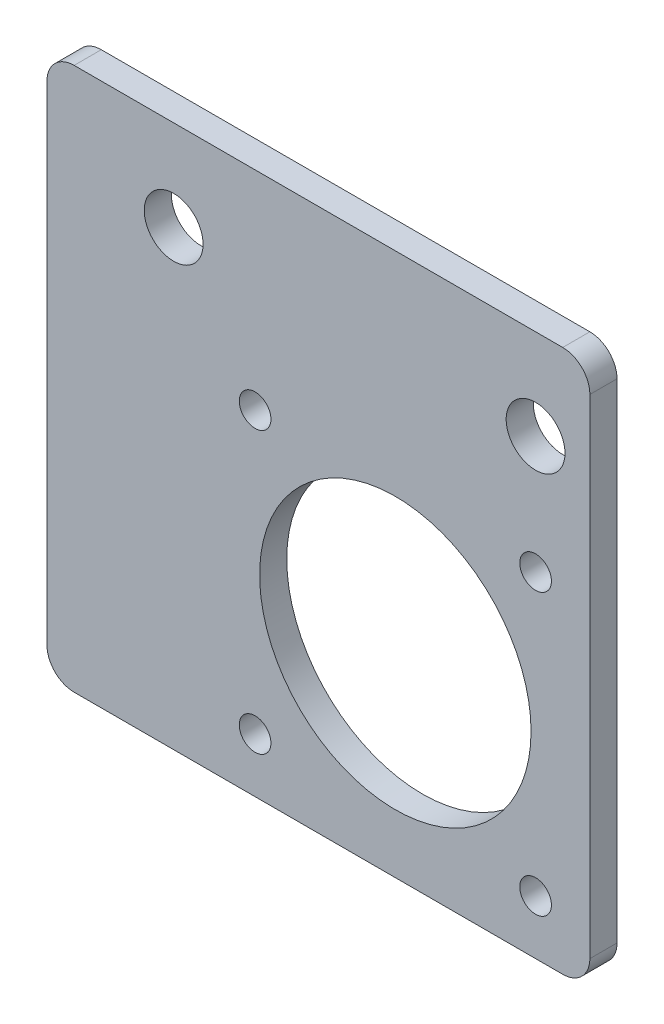
ISO-10303-21;
HEADER;
FILE_DESCRIPTION(('STEP AP214'),'2;1');
FILE_NAME('part.step','',(''),(''),'','','');
FILE_SCHEMA(('AUTOMOTIVE_DESIGN { 1 0 10303 214 1 1 1 1 }'));
ENDSEC;
DATA;
#1=APPLICATION_CONTEXT('core data for automotive mechanical design processes');
#2=APPLICATION_PROTOCOL_DEFINITION('international standard','automotive_design',2000,#1);
#3=PRODUCT_CONTEXT('',#1,'mechanical');
#4=PRODUCT('Part','Part','',(#3));
#5=PRODUCT_RELATED_PRODUCT_CATEGORY('part','',(#4));
#6=PRODUCT_DEFINITION_FORMATION('','',#4);
#7=PRODUCT_DEFINITION_CONTEXT('part definition',#1,'design');
#8=PRODUCT_DEFINITION('design','',#6,#7);
#9=PRODUCT_DEFINITION_SHAPE('','',#8);
#10=(LENGTH_UNIT() NAMED_UNIT(*) SI_UNIT(.MILLI.,.METRE.));
#11=(NAMED_UNIT(*) PLANE_ANGLE_UNIT() SI_UNIT($,.RADIAN.));
#12=(NAMED_UNIT(*) SI_UNIT($,.STERADIAN.) SOLID_ANGLE_UNIT());
#13=UNCERTAINTY_MEASURE_WITH_UNIT(LENGTH_MEASURE(1.E-05),#10,'distance_accuracy_value','');
#14=(GEOMETRIC_REPRESENTATION_CONTEXT(3) GLOBAL_UNCERTAINTY_ASSIGNED_CONTEXT((#13)) GLOBAL_UNIT_ASSIGNED_CONTEXT((#10,
#11,#12)) REPRESENTATION_CONTEXT('',''));
#15=CARTESIAN_POINT('',(0.,0.,0.));
#16=DIRECTION('',(0.,0.,1.));
#17=DIRECTION('',(1.,0.,0.));
#18=AXIS2_PLACEMENT_3D('',#15,#16,#17);
#19=CARTESIAN_POINT('',(-30.,30.,3.));
#20=DIRECTION('',(1.,0.,0.));
#21=DIRECTION('',(0.,1.,0.));
#22=AXIS2_PLACEMENT_3D('',#19,#20,#21);
#23=PLANE('',#22);
#24=DIRECTION('',(0.,-1.,0.));
#25=VECTOR('',#24,1.);
#26=CARTESIAN_POINT('',(-30.,30.,3.));
#27=LINE('',#26,#25);
#28=CARTESIAN_POINT('',(-30.,27.,3.));
#29=VERTEX_POINT('',#28);
#30=CARTESIAN_POINT('',(-30.,-27.,3.));
#31=VERTEX_POINT('',#30);
#32=EDGE_CURVE('E122',#29,#31,#27,.T.);
#33=ORIENTED_EDGE('',*,*,#32,.F.);
#34=DIRECTION('',(0.,0.,-1.));
#35=VECTOR('',#34,1.);
#36=CARTESIAN_POINT('',(-30.,27.,3.));
#37=LINE('',#36,#35);
#38=CARTESIAN_POINT('',(-30.,27.,0.));
#39=VERTEX_POINT('',#38);
#40=EDGE_CURVE('E107',#29,#39,#37,.T.);
#41=ORIENTED_EDGE('',*,*,#40,.T.);
#42=DIRECTION('',(0.,-1.,0.));
#43=VECTOR('',#42,1.);
#44=CARTESIAN_POINT('',(-30.,30.,0.));
#45=LINE('',#44,#43);
#46=CARTESIAN_POINT('',(-30.,-27.,0.));
#47=VERTEX_POINT('',#46);
#48=EDGE_CURVE('E119',#39,#47,#45,.T.);
#49=ORIENTED_EDGE('',*,*,#48,.T.);
#50=DIRECTION('',(0.,0.,-1.));
#51=VECTOR('',#50,1.);
#52=CARTESIAN_POINT('',(-30.,-27.,3.));
#53=LINE('',#52,#51);
#54=EDGE_CURVE('E124',#47,#31,#53,.F.);
#55=ORIENTED_EDGE('',*,*,#54,.T.);
#56=EDGE_LOOP('',(#33,#41,#49,#55));
#57=FACE_BOUND('',#56,.T.);
#58=ADVANCED_FACE('F35',(#57),#23,.F.);
#59=CARTESIAN_POINT('',(30.,-30.,3.));
#60=DIRECTION('',(0.,1.,0.));
#61=DIRECTION('',(-1.,0.,0.));
#62=AXIS2_PLACEMENT_3D('',#59,#60,#61);
#63=PLANE('',#62);
#64=DIRECTION('',(1.,0.,0.));
#65=VECTOR('',#64,1.);
#66=CARTESIAN_POINT('',(30.,-30.,0.));
#67=LINE('',#66,#65);
#68=CARTESIAN_POINT('',(-27.,-30.,0.));
#69=VERTEX_POINT('',#68);
#70=CARTESIAN_POINT('',(27.,-30.,0.));
#71=VERTEX_POINT('',#70);
#72=EDGE_CURVE('E128',#69,#71,#67,.T.);
#73=ORIENTED_EDGE('',*,*,#72,.T.);
#74=DIRECTION('',(0.,0.,-1.));
#75=VECTOR('',#74,1.);
#76=CARTESIAN_POINT('',(27.,-30.,3.));
#77=LINE('',#76,#75);
#78=CARTESIAN_POINT('',(27.,-30.,3.));
#79=VERTEX_POINT('',#78);
#80=EDGE_CURVE('E11',#71,#79,#77,.F.);
#81=ORIENTED_EDGE('',*,*,#80,.T.);
#82=DIRECTION('',(1.,0.,0.));
#83=VECTOR('',#82,1.);
#84=CARTESIAN_POINT('',(30.,-30.,3.));
#85=LINE('',#84,#83);
#86=CARTESIAN_POINT('',(-27.,-30.,3.));
#87=VERTEX_POINT('',#86);
#88=EDGE_CURVE('E204',#87,#79,#85,.T.);
#89=ORIENTED_EDGE('',*,*,#88,.F.);
#90=DIRECTION('',(0.,0.,-1.));
#91=VECTOR('',#90,1.);
#92=CARTESIAN_POINT('',(-27.,-30.,3.));
#93=LINE('',#92,#91);
#94=EDGE_CURVE('E44',#87,#69,#93,.T.);
#95=ORIENTED_EDGE('',*,*,#94,.T.);
#96=EDGE_LOOP('',(#73,#81,#89,#95));
#97=FACE_BOUND('',#96,.T.);
#98=ADVANCED_FACE('F222',(#97),#63,.F.);
#99=CARTESIAN_POINT('',(30.,30.,3.));
#100=DIRECTION('',(-1.,0.,0.));
#101=DIRECTION('',(0.,-1.,0.));
#102=AXIS2_PLACEMENT_3D('',#99,#100,#101);
#103=PLANE('',#102);
#104=DIRECTION('',(0.,1.,0.));
#105=VECTOR('',#104,1.);
#106=CARTESIAN_POINT('',(30.,30.,0.));
#107=LINE('',#106,#105);
#108=CARTESIAN_POINT('',(30.,-27.,0.));
#109=VERTEX_POINT('',#108);
#110=CARTESIAN_POINT('',(30.,27.,0.));
#111=VERTEX_POINT('',#110);
#112=EDGE_CURVE('E132',#109,#111,#107,.T.);
#113=ORIENTED_EDGE('',*,*,#112,.T.);
#114=DIRECTION('',(0.,0.,-1.));
#115=VECTOR('',#114,1.);
#116=CARTESIAN_POINT('',(30.,27.,3.));
#117=LINE('',#116,#115);
#118=CARTESIAN_POINT('',(30.,27.,3.));
#119=VERTEX_POINT('',#118);
#120=EDGE_CURVE('E52',#111,#119,#117,.F.);
#121=ORIENTED_EDGE('',*,*,#120,.T.);
#122=DIRECTION('',(0.,1.,0.));
#123=VECTOR('',#122,1.);
#124=CARTESIAN_POINT('',(30.,30.,3.));
#125=LINE('',#124,#123);
#126=CARTESIAN_POINT('',(30.,-27.,3.));
#127=VERTEX_POINT('',#126);
#128=EDGE_CURVE('E205',#127,#119,#125,.T.);
#129=ORIENTED_EDGE('',*,*,#128,.F.);
#130=DIRECTION('',(0.,0.,-1.));
#131=VECTOR('',#130,1.);
#132=CARTESIAN_POINT('',(30.,-27.,3.));
#133=LINE('',#132,#131);
#134=EDGE_CURVE('E159',#127,#109,#133,.T.);
#135=ORIENTED_EDGE('',*,*,#134,.T.);
#136=EDGE_LOOP('',(#113,#121,#129,#135));
#137=FACE_BOUND('',#136,.T.);
#138=ADVANCED_FACE('F216',(#137),#103,.F.);
#139=CARTESIAN_POINT('',(30.,30.,3.));
#140=DIRECTION('',(0.,-1.,0.));
#141=DIRECTION('',(1.,0.,0.));
#142=AXIS2_PLACEMENT_3D('',#139,#140,#141);
#143=PLANE('',#142);
#144=DIRECTION('',(-1.,0.,0.));
#145=VECTOR('',#144,1.);
#146=CARTESIAN_POINT('',(30.,30.,0.));
#147=LINE('',#146,#145);
#148=CARTESIAN_POINT('',(27.,30.,0.));
#149=VERTEX_POINT('',#148);
#150=CARTESIAN_POINT('',(-27.,30.,0.));
#151=VERTEX_POINT('',#150);
#152=EDGE_CURVE('E142',#149,#151,#147,.T.);
#153=ORIENTED_EDGE('',*,*,#152,.T.);
#154=DIRECTION('',(0.,0.,-1.));
#155=VECTOR('',#154,1.);
#156=CARTESIAN_POINT('',(-27.,30.,3.));
#157=LINE('',#156,#155);
#158=CARTESIAN_POINT('',(-27.,30.,3.));
#159=VERTEX_POINT('',#158);
#160=EDGE_CURVE('E108',#151,#159,#157,.F.);
#161=ORIENTED_EDGE('',*,*,#160,.T.);
#162=DIRECTION('',(-1.,0.,0.));
#163=VECTOR('',#162,1.);
#164=CARTESIAN_POINT('',(30.,30.,3.));
#165=LINE('',#164,#163);
#166=CARTESIAN_POINT('',(27.,30.,3.));
#167=VERTEX_POINT('',#166);
#168=EDGE_CURVE('E138',#167,#159,#165,.T.);
#169=ORIENTED_EDGE('',*,*,#168,.F.);
#170=DIRECTION('',(0.,0.,-1.));
#171=VECTOR('',#170,1.);
#172=CARTESIAN_POINT('',(27.,30.,3.));
#173=LINE('',#172,#171);
#174=EDGE_CURVE('E113',#167,#149,#173,.T.);
#175=ORIENTED_EDGE('',*,*,#174,.T.);
#176=EDGE_LOOP('',(#153,#161,#169,#175));
#177=FACE_BOUND('',#176,.T.);
#178=ADVANCED_FACE('F212',(#177),#143,.F.);
#179=CARTESIAN_POINT('',(-30.,-30.,3.));
#180=DIRECTION('',(0.,0.,-1.));
#181=DIRECTION('',(-1.,0.,0.));
#182=AXIS2_PLACEMENT_3D('',#179,#180,#181);
#183=PLANE('',#182);
#184=CARTESIAN_POINT('',(8.5,-8.50000000000001,3.));
#185=DIRECTION('',(0.,0.,1.));
#186=DIRECTION('',(1.,0.,0.));
#187=AXIS2_PLACEMENT_3D('',#184,#185,#186);
#188=CIRCLE('',#187,15.);
#189=CARTESIAN_POINT('',(23.5,-8.50000000000001,3.));
#190=VERTEX_POINT('',#189);
#191=EDGE_CURVE('E192',#190,#190,#188,.T.);
#192=ORIENTED_EDGE('',*,*,#191,.F.);
#193=EDGE_LOOP('',(#192));
#194=FACE_BOUND('',#193,.T.);
#195=CARTESIAN_POINT('',(-16.,20.,3.));
#196=DIRECTION('',(0.,0.,1.));
#197=DIRECTION('',(1.,0.,0.));
#198=AXIS2_PLACEMENT_3D('',#195,#196,#197);
#199=CIRCLE('',#198,3.25);
#200=CARTESIAN_POINT('',(-12.75,20.,3.));
#201=VERTEX_POINT('',#200);
#202=EDGE_CURVE('E182',#201,#201,#199,.T.);
#203=ORIENTED_EDGE('',*,*,#202,.F.);
#204=EDGE_LOOP('',(#203));
#205=FACE_BOUND('',#204,.T.);
#206=CARTESIAN_POINT('',(24.,20.,3.));
#207=DIRECTION('',(0.,0.,1.));
#208=DIRECTION('',(1.,0.,0.));
#209=AXIS2_PLACEMENT_3D('',#206,#207,#208);
#210=CIRCLE('',#209,3.25);
#211=CARTESIAN_POINT('',(27.25,20.,3.));
#212=VERTEX_POINT('',#211);
#213=EDGE_CURVE('E179',#212,#212,#210,.T.);
#214=ORIENTED_EDGE('',*,*,#213,.F.);
#215=EDGE_LOOP('',(#214));
#216=FACE_BOUND('',#215,.T.);
#217=CARTESIAN_POINT('',(24.,-24.,3.));
#218=DIRECTION('',(0.,0.,1.));
#219=DIRECTION('',(1.,0.,0.));
#220=AXIS2_PLACEMENT_3D('',#217,#218,#219);
#221=CIRCLE('',#220,1.75);
#222=CARTESIAN_POINT('',(25.75,-24.,3.));
#223=VERTEX_POINT('',#222);
#224=EDGE_CURVE('E176',#223,#223,#221,.T.);
#225=ORIENTED_EDGE('',*,*,#224,.F.);
#226=EDGE_LOOP('',(#225));
#227=FACE_BOUND('',#226,.T.);
#228=CARTESIAN_POINT('',(24.,6.99999999999999,3.));
#229=DIRECTION('',(0.,0.,1.));
#230=DIRECTION('',(1.,0.,0.));
#231=AXIS2_PLACEMENT_3D('',#228,#229,#230);
#232=CIRCLE('',#231,1.75);
#233=CARTESIAN_POINT('',(25.75,6.99999999999999,3.));
#234=VERTEX_POINT('',#233);
#235=EDGE_CURVE('E172',#234,#234,#232,.T.);
#236=ORIENTED_EDGE('',*,*,#235,.F.);
#237=EDGE_LOOP('',(#236));
#238=FACE_BOUND('',#237,.T.);
#239=CARTESIAN_POINT('',(-7.,6.99999999999999,3.));
#240=DIRECTION('',(0.,0.,1.));
#241=DIRECTION('',(1.,0.,0.));
#242=AXIS2_PLACEMENT_3D('',#239,#240,#241);
#243=CIRCLE('',#242,1.75);
#244=CARTESIAN_POINT('',(-5.25,6.99999999999999,3.));
#245=VERTEX_POINT('',#244);
#246=EDGE_CURVE('E168',#245,#245,#243,.T.);
#247=ORIENTED_EDGE('',*,*,#246,.F.);
#248=EDGE_LOOP('',(#247));
#249=FACE_BOUND('',#248,.T.);
#250=CARTESIAN_POINT('',(-7.,-24.,3.));
#251=DIRECTION('',(0.,0.,1.));
#252=DIRECTION('',(1.,0.,0.));
#253=AXIS2_PLACEMENT_3D('',#250,#251,#252);
#254=CIRCLE('',#253,1.75);
#255=CARTESIAN_POINT('',(-5.25,-24.,3.));
#256=VERTEX_POINT('',#255);
#257=EDGE_CURVE('E135',#256,#256,#254,.T.);
#258=ORIENTED_EDGE('',*,*,#257,.F.);
#259=EDGE_LOOP('',(#258));
#260=FACE_BOUND('',#259,.T.);
#261=ORIENTED_EDGE('',*,*,#168,.T.);
#262=CARTESIAN_POINT('',(-27.,27.,3.));
#263=DIRECTION('',(0.,0.,-1.));
#264=DIRECTION('',(-1.,0.,0.));
#265=AXIS2_PLACEMENT_3D('',#262,#263,#264);
#266=CIRCLE('',#265,3.);
#267=EDGE_CURVE('E157',#159,#29,#266,.F.);
#268=ORIENTED_EDGE('',*,*,#267,.T.);
#269=ORIENTED_EDGE('',*,*,#32,.T.);
#270=CARTESIAN_POINT('',(-27.,-27.,3.));
#271=DIRECTION('',(0.,0.,-1.));
#272=DIRECTION('',(-1.,0.,0.));
#273=AXIS2_PLACEMENT_3D('',#270,#271,#272);
#274=CIRCLE('',#273,3.);
#275=EDGE_CURVE('E152',#31,#87,#274,.F.);
#276=ORIENTED_EDGE('',*,*,#275,.T.);
#277=ORIENTED_EDGE('',*,*,#88,.T.);
#278=CARTESIAN_POINT('',(27.,-27.,3.));
#279=DIRECTION('',(0.,0.,-1.));
#280=DIRECTION('',(-1.,0.,0.));
#281=AXIS2_PLACEMENT_3D('',#278,#279,#280);
#282=CIRCLE('',#281,3.);
#283=EDGE_CURVE('E59',#79,#127,#282,.F.);
#284=ORIENTED_EDGE('',*,*,#283,.T.);
#285=ORIENTED_EDGE('',*,*,#128,.T.);
#286=CARTESIAN_POINT('',(27.,27.,3.));
#287=DIRECTION('',(0.,0.,-1.));
#288=DIRECTION('',(-1.,0.,0.));
#289=AXIS2_PLACEMENT_3D('',#286,#287,#288);
#290=CIRCLE('',#289,3.);
#291=EDGE_CURVE('E155',#119,#167,#290,.F.);
#292=ORIENTED_EDGE('',*,*,#291,.T.);
#293=EDGE_LOOP('',(#261,#268,#269,#276,#277,#284,#285,#292));
#294=FACE_BOUND('',#293,.T.);
#295=ADVANCED_FACE('F209',(#194,#205,#216,#227,#238,#249,#260,#294),#183,.F.);
#296=CARTESIAN_POINT('',(-30.,-30.,0.));
#297=DIRECTION('',(0.,0.,-1.));
#298=DIRECTION('',(-1.,0.,0.));
#299=AXIS2_PLACEMENT_3D('',#296,#297,#298);
#300=PLANE('',#299);
#301=CARTESIAN_POINT('',(8.5,-8.50000000000001,0.));
#302=DIRECTION('',(0.,0.,-1.));
#303=DIRECTION('',(-1.,0.,0.));
#304=AXIS2_PLACEMENT_3D('',#301,#302,#303);
#305=CIRCLE('',#304,15.);
#306=CARTESIAN_POINT('',(-6.5,-8.50000000000001,0.));
#307=VERTEX_POINT('',#306);
#308=EDGE_CURVE('E39',#307,#307,#305,.T.);
#309=ORIENTED_EDGE('',*,*,#308,.F.);
#310=EDGE_LOOP('',(#309));
#311=FACE_BOUND('',#310,.T.);
#312=CARTESIAN_POINT('',(-16.,20.,0.));
#313=DIRECTION('',(0.,0.,-1.));
#314=DIRECTION('',(-1.,0.,0.));
#315=AXIS2_PLACEMENT_3D('',#312,#313,#314);
#316=CIRCLE('',#315,3.25);
#317=CARTESIAN_POINT('',(-19.25,20.,0.));
#318=VERTEX_POINT('',#317);
#319=EDGE_CURVE('E180',#318,#318,#316,.T.);
#320=ORIENTED_EDGE('',*,*,#319,.F.);
#321=EDGE_LOOP('',(#320));
#322=FACE_BOUND('',#321,.T.);
#323=CARTESIAN_POINT('',(24.,20.,0.));
#324=DIRECTION('',(0.,0.,-1.));
#325=DIRECTION('',(-1.,0.,0.));
#326=AXIS2_PLACEMENT_3D('',#323,#324,#325);
#327=CIRCLE('',#326,3.25);
#328=CARTESIAN_POINT('',(20.75,20.,0.));
#329=VERTEX_POINT('',#328);
#330=EDGE_CURVE('E177',#329,#329,#327,.T.);
#331=ORIENTED_EDGE('',*,*,#330,.F.);
#332=EDGE_LOOP('',(#331));
#333=FACE_BOUND('',#332,.T.);
#334=CARTESIAN_POINT('',(24.,-24.,0.));
#335=DIRECTION('',(0.,0.,-1.));
#336=DIRECTION('',(-1.,0.,0.));
#337=AXIS2_PLACEMENT_3D('',#334,#335,#336);
#338=CIRCLE('',#337,1.75);
#339=CARTESIAN_POINT('',(22.25,-24.,0.));
#340=VERTEX_POINT('',#339);
#341=EDGE_CURVE('E173',#340,#340,#338,.T.);
#342=ORIENTED_EDGE('',*,*,#341,.F.);
#343=EDGE_LOOP('',(#342));
#344=FACE_BOUND('',#343,.T.);
#345=CARTESIAN_POINT('',(24.,6.99999999999999,0.));
#346=DIRECTION('',(0.,0.,-1.));
#347=DIRECTION('',(-1.,0.,0.));
#348=AXIS2_PLACEMENT_3D('',#345,#346,#347);
#349=CIRCLE('',#348,1.75);
#350=CARTESIAN_POINT('',(22.25,6.99999999999999,0.));
#351=VERTEX_POINT('',#350);
#352=EDGE_CURVE('E169',#351,#351,#349,.T.);
#353=ORIENTED_EDGE('',*,*,#352,.F.);
#354=EDGE_LOOP('',(#353));
#355=FACE_BOUND('',#354,.T.);
#356=CARTESIAN_POINT('',(-7.,6.99999999999999,0.));
#357=DIRECTION('',(0.,0.,-1.));
#358=DIRECTION('',(-1.,0.,0.));
#359=AXIS2_PLACEMENT_3D('',#356,#357,#358);
#360=CIRCLE('',#359,1.75);
#361=CARTESIAN_POINT('',(-8.75,6.99999999999999,0.));
#362=VERTEX_POINT('',#361);
#363=EDGE_CURVE('E165',#362,#362,#360,.T.);
#364=ORIENTED_EDGE('',*,*,#363,.F.);
#365=EDGE_LOOP('',(#364));
#366=FACE_BOUND('',#365,.T.);
#367=CARTESIAN_POINT('',(-7.,-24.,0.));
#368=DIRECTION('',(0.,0.,-1.));
#369=DIRECTION('',(-1.,0.,0.));
#370=AXIS2_PLACEMENT_3D('',#367,#368,#369);
#371=CIRCLE('',#370,1.75);
#372=CARTESIAN_POINT('',(-8.75,-24.,0.));
#373=VERTEX_POINT('',#372);
#374=EDGE_CURVE('E129',#373,#373,#371,.T.);
#375=ORIENTED_EDGE('',*,*,#374,.F.);
#376=EDGE_LOOP('',(#375));
#377=FACE_BOUND('',#376,.T.);
#378=ORIENTED_EDGE('',*,*,#48,.F.);
#379=CARTESIAN_POINT('',(-27.,27.,0.));
#380=DIRECTION('',(0.,0.,-1.));
#381=DIRECTION('',(-1.,0.,0.));
#382=AXIS2_PLACEMENT_3D('',#379,#380,#381);
#383=CIRCLE('',#382,3.);
#384=EDGE_CURVE('E103',#39,#151,#383,.T.);
#385=ORIENTED_EDGE('',*,*,#384,.T.);
#386=ORIENTED_EDGE('',*,*,#152,.F.);
#387=CARTESIAN_POINT('',(27.,27.,0.));
#388=DIRECTION('',(0.,0.,-1.));
#389=DIRECTION('',(-1.,0.,0.));
#390=AXIS2_PLACEMENT_3D('',#387,#388,#389);
#391=CIRCLE('',#390,3.);
#392=EDGE_CURVE('E114',#149,#111,#391,.T.);
#393=ORIENTED_EDGE('',*,*,#392,.T.);
#394=ORIENTED_EDGE('',*,*,#112,.F.);
#395=CARTESIAN_POINT('',(27.,-27.,0.));
#396=DIRECTION('',(0.,0.,-1.));
#397=DIRECTION('',(-1.,0.,0.));
#398=AXIS2_PLACEMENT_3D('',#395,#396,#397);
#399=CIRCLE('',#398,3.);
#400=EDGE_CURVE('E146',#109,#71,#399,.T.);
#401=ORIENTED_EDGE('',*,*,#400,.T.);
#402=ORIENTED_EDGE('',*,*,#72,.F.);
#403=CARTESIAN_POINT('',(-27.,-27.,0.));
#404=DIRECTION('',(0.,0.,-1.));
#405=DIRECTION('',(-1.,0.,0.));
#406=AXIS2_PLACEMENT_3D('',#403,#404,#405);
#407=CIRCLE('',#406,3.);
#408=EDGE_CURVE('E123',#69,#47,#407,.T.);
#409=ORIENTED_EDGE('',*,*,#408,.T.);
#410=EDGE_LOOP('',(#378,#385,#386,#393,#394,#401,#402,#409));
#411=FACE_BOUND('',#410,.T.);
#412=ADVANCED_FACE('F126',(#311,#322,#333,#344,#355,#366,#377,#411),#300,.T.);
#413=CARTESIAN_POINT('',(-27.,27.,3.));
#414=DIRECTION('',(0.,0.,-1.));
#415=DIRECTION('',(-1.,0.,0.));
#416=AXIS2_PLACEMENT_3D('',#413,#414,#415);
#417=CYLINDRICAL_SURFACE('',#416,3.);
#418=ORIENTED_EDGE('',*,*,#267,.F.);
#419=ORIENTED_EDGE('',*,*,#160,.F.);
#420=ORIENTED_EDGE('',*,*,#384,.F.);
#421=ORIENTED_EDGE('',*,*,#40,.F.);
#422=EDGE_LOOP('',(#418,#419,#420,#421));
#423=FACE_BOUND('',#422,.T.);
#424=ADVANCED_FACE('F106',(#423),#417,.T.);
#425=CARTESIAN_POINT('',(27.,27.,3.));
#426=DIRECTION('',(0.,0.,-1.));
#427=DIRECTION('',(-1.,0.,0.));
#428=AXIS2_PLACEMENT_3D('',#425,#426,#427);
#429=CYLINDRICAL_SURFACE('',#428,3.);
#430=ORIENTED_EDGE('',*,*,#291,.F.);
#431=ORIENTED_EDGE('',*,*,#120,.F.);
#432=ORIENTED_EDGE('',*,*,#392,.F.);
#433=ORIENTED_EDGE('',*,*,#174,.F.);
#434=EDGE_LOOP('',(#430,#431,#432,#433));
#435=FACE_BOUND('',#434,.T.);
#436=ADVANCED_FACE('F214',(#435),#429,.T.);
#437=CARTESIAN_POINT('',(27.,-27.,3.));
#438=DIRECTION('',(0.,0.,-1.));
#439=DIRECTION('',(-1.,0.,0.));
#440=AXIS2_PLACEMENT_3D('',#437,#438,#439);
#441=CYLINDRICAL_SURFACE('',#440,3.);
#442=ORIENTED_EDGE('',*,*,#283,.F.);
#443=ORIENTED_EDGE('',*,*,#80,.F.);
#444=ORIENTED_EDGE('',*,*,#400,.F.);
#445=ORIENTED_EDGE('',*,*,#134,.F.);
#446=EDGE_LOOP('',(#442,#443,#444,#445));
#447=FACE_BOUND('',#446,.T.);
#448=ADVANCED_FACE('F219',(#447),#441,.T.);
#449=CARTESIAN_POINT('',(-27.,-27.,3.));
#450=DIRECTION('',(0.,0.,-1.));
#451=DIRECTION('',(-1.,0.,0.));
#452=AXIS2_PLACEMENT_3D('',#449,#450,#451);
#453=CYLINDRICAL_SURFACE('',#452,3.);
#454=ORIENTED_EDGE('',*,*,#275,.F.);
#455=ORIENTED_EDGE('',*,*,#54,.F.);
#456=ORIENTED_EDGE('',*,*,#408,.F.);
#457=ORIENTED_EDGE('',*,*,#94,.F.);
#458=EDGE_LOOP('',(#454,#455,#456,#457));
#459=FACE_BOUND('',#458,.T.);
#460=ADVANCED_FACE('F37',(#459),#453,.T.);
#461=CARTESIAN_POINT('',(-7.,-24.,-9.));
#462=DIRECTION('',(0.,0.,1.));
#463=DIRECTION('',(1.,0.,0.));
#464=AXIS2_PLACEMENT_3D('',#461,#462,#463);
#465=CYLINDRICAL_SURFACE('',#464,1.75);
#466=ORIENTED_EDGE('',*,*,#374,.T.);
#467=EDGE_LOOP('',(#466));
#468=FACE_BOUND('',#467,.T.);
#469=ORIENTED_EDGE('',*,*,#257,.T.);
#470=EDGE_LOOP('',(#469));
#471=FACE_BOUND('',#470,.T.);
#472=ADVANCED_FACE('F228',(#468,#471),#465,.F.);
#473=CARTESIAN_POINT('',(-7.,6.99999999999999,-9.));
#474=DIRECTION('',(0.,0.,1.));
#475=DIRECTION('',(1.,0.,0.));
#476=AXIS2_PLACEMENT_3D('',#473,#474,#475);
#477=CYLINDRICAL_SURFACE('',#476,1.75);
#478=ORIENTED_EDGE('',*,*,#363,.T.);
#479=EDGE_LOOP('',(#478));
#480=FACE_BOUND('',#479,.T.);
#481=ORIENTED_EDGE('',*,*,#246,.T.);
#482=EDGE_LOOP('',(#481));
#483=FACE_BOUND('',#482,.T.);
#484=ADVANCED_FACE('F233',(#480,#483),#477,.F.);
#485=CARTESIAN_POINT('',(24.,6.99999999999999,-9.));
#486=DIRECTION('',(0.,0.,1.));
#487=DIRECTION('',(1.,0.,0.));
#488=AXIS2_PLACEMENT_3D('',#485,#486,#487);
#489=CYLINDRICAL_SURFACE('',#488,1.75);
#490=ORIENTED_EDGE('',*,*,#352,.T.);
#491=EDGE_LOOP('',(#490));
#492=FACE_BOUND('',#491,.T.);
#493=ORIENTED_EDGE('',*,*,#235,.T.);
#494=EDGE_LOOP('',(#493));
#495=FACE_BOUND('',#494,.T.);
#496=ADVANCED_FACE('F295',(#492,#495),#489,.F.);
#497=CARTESIAN_POINT('',(24.,-24.,-9.));
#498=DIRECTION('',(0.,0.,1.));
#499=DIRECTION('',(1.,0.,0.));
#500=AXIS2_PLACEMENT_3D('',#497,#498,#499);
#501=CYLINDRICAL_SURFACE('',#500,1.75);
#502=ORIENTED_EDGE('',*,*,#341,.T.);
#503=EDGE_LOOP('',(#502));
#504=FACE_BOUND('',#503,.T.);
#505=ORIENTED_EDGE('',*,*,#224,.T.);
#506=EDGE_LOOP('',(#505));
#507=FACE_BOUND('',#506,.T.);
#508=ADVANCED_FACE('F305',(#504,#507),#501,.F.);
#509=CARTESIAN_POINT('',(24.,20.,-9.));
#510=DIRECTION('',(0.,0.,1.));
#511=DIRECTION('',(1.,0.,0.));
#512=AXIS2_PLACEMENT_3D('',#509,#510,#511);
#513=CYLINDRICAL_SURFACE('',#512,3.25);
#514=ORIENTED_EDGE('',*,*,#330,.T.);
#515=EDGE_LOOP('',(#514));
#516=FACE_BOUND('',#515,.T.);
#517=ORIENTED_EDGE('',*,*,#213,.T.);
#518=EDGE_LOOP('',(#517));
#519=FACE_BOUND('',#518,.T.);
#520=ADVANCED_FACE('F315',(#516,#519),#513,.F.);
#521=CARTESIAN_POINT('',(-16.,20.,-9.));
#522=DIRECTION('',(0.,0.,1.));
#523=DIRECTION('',(1.,0.,0.));
#524=AXIS2_PLACEMENT_3D('',#521,#522,#523);
#525=CYLINDRICAL_SURFACE('',#524,3.25);
#526=ORIENTED_EDGE('',*,*,#319,.T.);
#527=EDGE_LOOP('',(#526));
#528=FACE_BOUND('',#527,.T.);
#529=ORIENTED_EDGE('',*,*,#202,.T.);
#530=EDGE_LOOP('',(#529));
#531=FACE_BOUND('',#530,.T.);
#532=ADVANCED_FACE('F325',(#528,#531),#525,.F.);
#533=CARTESIAN_POINT('',(8.5,-8.50000000000001,-9.));
#534=DIRECTION('',(0.,0.,1.));
#535=DIRECTION('',(1.,0.,0.));
#536=AXIS2_PLACEMENT_3D('',#533,#534,#535);
#537=CYLINDRICAL_SURFACE('',#536,15.);
#538=ORIENTED_EDGE('',*,*,#308,.T.);
#539=EDGE_LOOP('',(#538));
#540=FACE_BOUND('',#539,.T.);
#541=ORIENTED_EDGE('',*,*,#191,.T.);
#542=EDGE_LOOP('',(#541));
#543=FACE_BOUND('',#542,.T.);
#544=ADVANCED_FACE('F335',(#540,#543),#537,.F.);
#545=CLOSED_SHELL('',(#58,#98,#138,#178,#295,#412,#424,#436,#448,#460,#472,#484,#496,#508,#520,
#532,#544));
#546=MANIFOLD_SOLID_BREP('B2',#545);
#547=ADVANCED_BREP_SHAPE_REPRESENTATION('',(#18,#546),#14);
#548=SHAPE_DEFINITION_REPRESENTATION(#9,#547);
ENDSEC;
END-ISO-10303-21;
